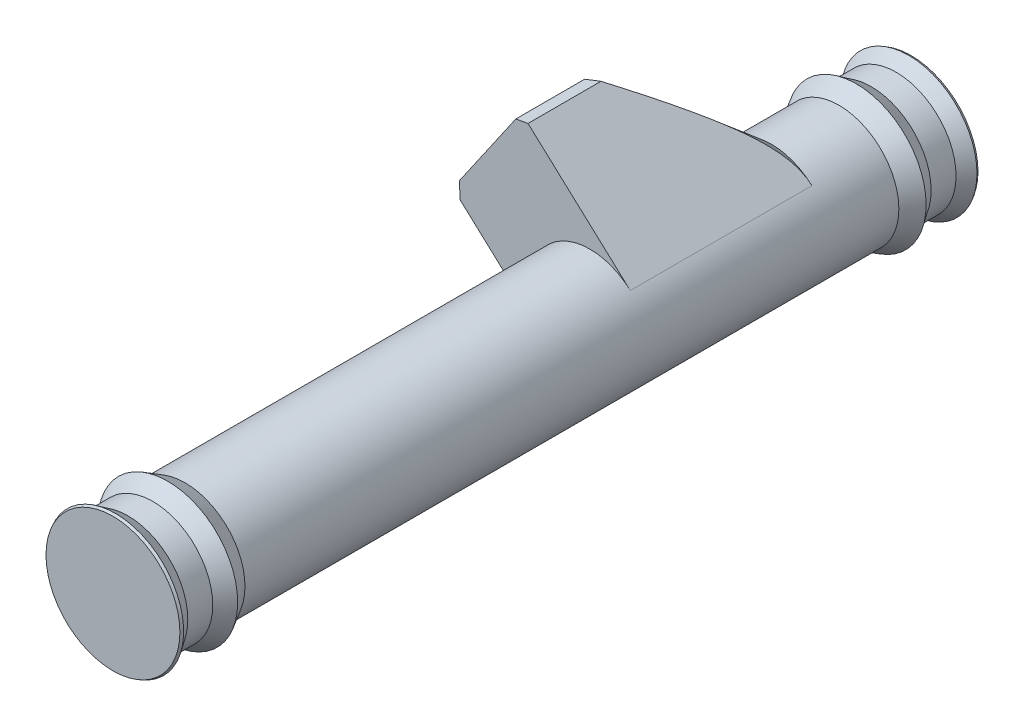
ISO-10303-21;
HEADER;
FILE_DESCRIPTION(('STEP AP214'),'2;1');
FILE_NAME('part.step','',(''),(''),'','','');
FILE_SCHEMA(('AUTOMOTIVE_DESIGN { 1 0 10303 214 1 1 1 1 }'));
ENDSEC;
DATA;
#1=APPLICATION_CONTEXT('core data for automotive mechanical design processes');
#2=APPLICATION_PROTOCOL_DEFINITION('international standard','automotive_design',2000,#1);
#3=PRODUCT_CONTEXT('',#1,'mechanical');
#4=PRODUCT('Part','Part','',(#3));
#5=PRODUCT_RELATED_PRODUCT_CATEGORY('part','',(#4));
#6=PRODUCT_DEFINITION_FORMATION('','',#4);
#7=PRODUCT_DEFINITION_CONTEXT('part definition',#1,'design');
#8=PRODUCT_DEFINITION('design','',#6,#7);
#9=PRODUCT_DEFINITION_SHAPE('','',#8);
#10=(LENGTH_UNIT() NAMED_UNIT(*) SI_UNIT(.MILLI.,.METRE.));
#11=(NAMED_UNIT(*) PLANE_ANGLE_UNIT() SI_UNIT($,.RADIAN.));
#12=(NAMED_UNIT(*) SI_UNIT($,.STERADIAN.) SOLID_ANGLE_UNIT());
#13=UNCERTAINTY_MEASURE_WITH_UNIT(LENGTH_MEASURE(1.E-05),#10,'distance_accuracy_value','');
#14=(GEOMETRIC_REPRESENTATION_CONTEXT(3) GLOBAL_UNCERTAINTY_ASSIGNED_CONTEXT((#13)) GLOBAL_UNIT_ASSIGNED_CONTEXT((#10,
#11,#12)) REPRESENTATION_CONTEXT('',''));
#15=CARTESIAN_POINT('',(0.,0.,0.));
#16=DIRECTION('',(0.,0.,1.));
#17=DIRECTION('',(1.,0.,0.));
#18=AXIS2_PLACEMENT_3D('',#15,#16,#17);
#19=CARTESIAN_POINT('',(58.1017180293076,-1.78433251703025,52.5));
#20=DIRECTION('',(0.,0.,-1.));
#21=DIRECTION('',(-1.,0.,0.));
#22=AXIS2_PLACEMENT_3D('',#19,#20,#21);
#23=CYLINDRICAL_SURFACE('',#22,5.99999999999999);
#24=CARTESIAN_POINT('',(58.1017180293076,-1.78433251703025,45.2679491924311));
#25=DIRECTION('',(0.,0.,-1.));
#26=DIRECTION('',(-1.,0.,0.));
#27=AXIS2_PLACEMENT_3D('',#24,#25,#26);
#28=CIRCLE('',#27,5.99999999999999);
#29=CARTESIAN_POINT('',(52.1017180293076,-1.78433251703025,45.2679491924311));
#30=VERTEX_POINT('',#29);
#31=EDGE_CURVE('E398',#30,#30,#28,.T.);
#32=ORIENTED_EDGE('',*,*,#31,.T.);
#33=EDGE_LOOP('',(#32));
#34=FACE_BOUND('',#33,.T.);
#35=CARTESIAN_POINT('',(58.1017180293076,-1.78433251703025,-20.2679491924311));
#36=DIRECTION('',(0.,0.,1.));
#37=DIRECTION('',(1.,0.,0.));
#38=AXIS2_PLACEMENT_3D('',#35,#36,#37);
#39=CIRCLE('',#38,5.99999999999999);
#40=CARTESIAN_POINT('',(64.1017180293076,-1.78433251703025,-20.2679491924311));
#41=VERTEX_POINT('',#40);
#42=EDGE_CURVE('E404',#41,#41,#39,.T.);
#43=ORIENTED_EDGE('',*,*,#42,.T.);
#44=EDGE_LOOP('',(#43));
#45=FACE_BOUND('',#44,.T.);
#46=DIRECTION('',(0.,0.,1.));
#47=VECTOR('',#46,1.);
#48=CARTESIAN_POINT('',(54.0520101920713,-6.21150615638832,-1.5));
#49=LINE('',#48,#47);
#50=CARTESIAN_POINT('',(54.0520101920713,-6.21150615638831,-13.5000000000001));
#51=VERTEX_POINT('',#50);
#52=CARTESIAN_POINT('',(54.0520101920713,-6.21150615638831,4.7));
#53=VERTEX_POINT('',#52);
#54=EDGE_CURVE('E177',#51,#53,#49,.T.);
#55=ORIENTED_EDGE('',*,*,#54,.F.);
#56=CARTESIAN_POINT('',(58.1017180293076,-1.78433251703025,-13.5000000000001));
#57=DIRECTION('',(0.,0.,1.));
#58=DIRECTION('',(1.,0.,0.));
#59=AXIS2_PLACEMENT_3D('',#56,#57,#58);
#60=CIRCLE('',#59,5.99999999999999);
#61=CARTESIAN_POINT('',(62.1514258665439,2.64284112232781,-13.5000000000001));
#62=VERTEX_POINT('',#61);
#63=EDGE_CURVE('E188',#51,#62,#60,.F.);
#64=ORIENTED_EDGE('',*,*,#63,.T.);
#65=DIRECTION('',(0.,0.,1.));
#66=VECTOR('',#65,1.);
#67=CARTESIAN_POINT('',(62.1514258665439,2.6428411223278,-1.5));
#68=LINE('',#67,#66);
#69=CARTESIAN_POINT('',(62.1514258665439,2.6428411223278,4.7));
#70=VERTEX_POINT('',#69);
#71=EDGE_CURVE('E176',#62,#70,#68,.T.);
#72=ORIENTED_EDGE('',*,*,#71,.T.);
#73=CARTESIAN_POINT('',(58.1017180293076,-1.78433251703025,4.7));
#74=DIRECTION('',(0.,0.,1.));
#75=DIRECTION('',(1.,0.,0.));
#76=AXIS2_PLACEMENT_3D('',#73,#74,#75);
#77=CIRCLE('',#76,5.99999999999999);
#78=EDGE_CURVE('E181',#70,#53,#77,.T.);
#79=ORIENTED_EDGE('',*,*,#78,.T.);
#80=EDGE_LOOP('',(#55,#64,#72,#79));
#81=FACE_BOUND('',#80,.T.);
#82=ADVANCED_FACE('F49',(#34,#45,#81),#23,.T.);
#83=CARTESIAN_POINT('',(58.1017180293076,-1.78433251703025,52.501));
#84=DIRECTION('',(0.,0.,-1.));
#85=DIRECTION('',(-1.,0.,0.));
#86=AXIS2_PLACEMENT_3D('',#83,#84,#85);
#87=CYLINDRICAL_SURFACE('',#86,1.4);
#88=CARTESIAN_POINT('',(58.1017180293076,-1.78433251703025,-4.9973174555522));
#89=DIRECTION('',(0.,0.,-1.));
#90=DIRECTION('',(-1.,0.,0.));
#91=AXIS2_PLACEMENT_3D('',#88,#89,#90);
#92=CIRCLE('',#91,1.4);
#93=CARTESIAN_POINT('',(56.7017180293076,-1.78433251703025,-4.9973174555522));
#94=VERTEX_POINT('',#93);
#95=EDGE_CURVE('E322',#94,#94,#92,.T.);
#96=ORIENTED_EDGE('',*,*,#95,.T.);
#97=EDGE_LOOP('',(#96));
#98=FACE_BOUND('',#97,.T.);
#99=CARTESIAN_POINT('',(58.1017180293076,-1.78433251703025,0.));
#100=DIRECTION('',(0.,0.,1.));
#101=DIRECTION('',(1.,0.,0.));
#102=AXIS2_PLACEMENT_3D('',#99,#100,#101);
#103=CIRCLE('',#102,1.4);
#104=CARTESIAN_POINT('',(59.5017180293076,-1.78433251703025,0.));
#105=VERTEX_POINT('',#104);
#106=EDGE_CURVE('E293',#105,#105,#103,.F.);
#107=ORIENTED_EDGE('',*,*,#106,.F.);
#108=EDGE_LOOP('',(#107));
#109=FACE_BOUND('',#108,.T.);
#110=ADVANCED_FACE('F233',(#98,#109),#87,.F.);
#111=CARTESIAN_POINT('',(58.1017180293076,-1.78433251703025,-23.5));
#112=DIRECTION('',(0.,0.,1.));
#113=DIRECTION('',(1.,0.,0.));
#114=AXIS2_PLACEMENT_3D('',#111,#112,#113);
#115=CIRCLE('',#114,6.);
#116=CARTESIAN_POINT('',(64.1017180293076,-1.78433251703025,-23.5));
#117=VERTEX_POINT('',#116);
#118=EDGE_CURVE('E270',#117,#117,#115,.T.);
#119=ORIENTED_EDGE('',*,*,#118,.F.);
#120=EDGE_LOOP('',(#119));
#121=FACE_BOUND('',#120,.T.);
#122=CARTESIAN_POINT('',(58.1017180293076,-1.78433251703025,-26.));
#123=DIRECTION('',(0.,0.,1.));
#124=DIRECTION('',(1.,0.,0.));
#125=AXIS2_PLACEMENT_3D('',#122,#123,#124);
#126=CIRCLE('',#125,5.99999999999999);
#127=CARTESIAN_POINT('',(64.1017180293076,-1.78433251703025,-26.));
#128=VERTEX_POINT('',#127);
#129=EDGE_CURVE('E285',#128,#128,#126,.T.);
#130=ORIENTED_EDGE('',*,*,#129,.T.);
#131=EDGE_LOOP('',(#130));
#132=FACE_BOUND('',#131,.T.);
#133=ADVANCED_FACE('F230',(#121,#132),#23,.T.);
#134=CARTESIAN_POINT('',(0.,0.,-27.5));
#135=DIRECTION('',(0.,0.,1.));
#136=DIRECTION('',(1.,0.,0.));
#137=AXIS2_PLACEMENT_3D('',#134,#135,#136);
#138=PLANE('',#137);
#139=CARTESIAN_POINT('',(58.1017180293076,-1.78433251703025,-27.5));
#140=DIRECTION('',(0.,0.,1.));
#141=DIRECTION('',(1.,0.,0.));
#142=AXIS2_PLACEMENT_3D('',#139,#140,#141);
#143=CIRCLE('',#142,6.7);
#144=CARTESIAN_POINT('',(64.8017180293076,-1.78433251703025,-27.5));
#145=VERTEX_POINT('',#144);
#146=EDGE_CURVE('E11',#145,#145,#143,.F.);
#147=ORIENTED_EDGE('',*,*,#146,.T.);
#148=EDGE_LOOP('',(#147));
#149=FACE_BOUND('',#148,.T.);
#150=CARTESIAN_POINT('',(58.1017180293076,-1.78433251703025,-27.5));
#151=DIRECTION('',(0.,0.,-1.));
#152=DIRECTION('',(-1.,0.,0.));
#153=AXIS2_PLACEMENT_3D('',#150,#151,#152);
#154=CIRCLE('',#153,3.5);
#155=CARTESIAN_POINT('',(54.6017180293076,-1.78433251703025,-27.5));
#156=VERTEX_POINT('',#155);
#157=EDGE_CURVE('E289',#156,#156,#154,.T.);
#158=ORIENTED_EDGE('',*,*,#157,.F.);
#159=EDGE_LOOP('',(#158));
#160=FACE_BOUND('',#159,.T.);
#161=ADVANCED_FACE('F227',(#149,#160),#138,.F.);
#162=CARTESIAN_POINT('',(58.1017180293076,-1.78433251703025,4.7));
#163=DIRECTION('',(0.,0.,1.));
#164=DIRECTION('',(1.,0.,0.));
#165=AXIS2_PLACEMENT_3D('',#162,#163,#164);
#166=PLANE('',#165);
#167=DIRECTION('',(-0.56841470062174,-0.822742200277279,0.));
#168=VECTOR('',#167,1.);
#169=CARTESIAN_POINT('',(51.2449403687312,12.6194274040442,4.7));
#170=LINE('',#169,#168);
#171=CARTESIAN_POINT('',(50.6765256681095,11.7966852037669,4.7));
#172=VERTEX_POINT('',#171);
#173=CARTESIAN_POINT('',(45.0250407455987,3.61653937908204,4.7));
#174=VERTEX_POINT('',#173);
#175=EDGE_CURVE('E165',#172,#174,#170,.T.);
#176=ORIENTED_EDGE('',*,*,#175,.T.);
#177=DIRECTION('',(-0.0444847713910527,0.999010062569084,0.));
#178=VECTOR('',#177,1.);
#179=CARTESIAN_POINT('',(45.290936828055,-2.35478189930472,4.7));
#180=LINE('',#179,#178);
#181=CARTESIAN_POINT('',(45.0979532479023,1.97911782535348,4.7));
#182=VERTEX_POINT('',#181);
#183=EDGE_CURVE('E340',#174,#182,#180,.F.);
#184=ORIENTED_EDGE('',*,*,#183,.T.);
#185=DIRECTION('',(0.737862273226343,-0.67495130620605,0.));
#186=VECTOR('',#185,1.);
#187=CARTESIAN_POINT('',(44.360090974676,2.65406913155952,4.7));
#188=LINE('',#187,#186);
#189=EDGE_CURVE('E173',#182,#53,#188,.T.);
#190=ORIENTED_EDGE('',*,*,#189,.T.);
#191=ORIENTED_EDGE('',*,*,#78,.F.);
#192=DIRECTION('',(-0.737862273226343,0.67495130620605,0.));
#193=VECTOR('',#192,1.);
#194=CARTESIAN_POINT('',(62.1514258665439,2.6428411223278,4.7));
#195=LINE('',#194,#193);
#196=CARTESIAN_POINT('',(51.8998737728878,12.0203343582911,4.7));
#197=VERTEX_POINT('',#196);
#198=EDGE_CURVE('E160',#70,#197,#195,.T.);
#199=ORIENTED_EDGE('',*,*,#198,.T.);
#200=DIRECTION('',(0.983696478320158,0.17983669964865,0.));
#201=VECTOR('',#200,1.);
#202=CARTESIAN_POINT('',(55.4590318644937,12.6710099059104,4.7));
#203=LINE('',#202,#201);
#204=EDGE_CURVE('E337',#197,#172,#203,.F.);
#205=ORIENTED_EDGE('',*,*,#204,.T.);
#206=EDGE_LOOP('',(#176,#184,#190,#191,#199,#205));
#207=FACE_BOUND('',#206,.T.);
#208=ADVANCED_FACE('F229',(#207),#166,.T.);
#209=CARTESIAN_POINT('',(44.360090974676,2.65406913155952,-1.5));
#210=DIRECTION('',(-0.67495130620605,-0.737862273226343,0.));
#211=DIRECTION('',(0.737862273226343,-0.67495130620605,0.));
#212=AXIS2_PLACEMENT_3D('',#209,#210,#211);
#213=PLANE('',#212);
#214=ORIENTED_EDGE('',*,*,#189,.F.);
#215=DIRECTION('',(0.,0.,-1.));
#216=VECTOR('',#215,1.);
#217=CARTESIAN_POINT('',(45.0979532479023,1.97911782535348,-1.5));
#218=LINE('',#217,#216);
#219=CARTESIAN_POINT('',(45.0979532479023,1.97911782535348,-4.51726510554778));
#220=VERTEX_POINT('',#219);
#221=EDGE_CURVE('E74',#182,#220,#218,.T.);
#222=ORIENTED_EDGE('',*,*,#221,.T.);
#223=CARTESIAN_POINT('',(44.360090974676,2.65406913155953,-3.44085182386826));
#224=CARTESIAN_POINT('',(44.5076075814179,2.51912995656661,-3.65756668432391));
#225=CARTESIAN_POINT('',(44.6554339646457,2.38390741697927,-3.87389476790729));
#226=CARTESIAN_POINT('',(44.9518014455375,2.11280856072496,-4.30565386154003));
#227=CARTESIAN_POINT('',(45.100342550647,1.97693223724713,-4.52108486220014));
#228=CARTESIAN_POINT('',(45.5475036104462,1.56789663216567,-5.16631280755206));
#229=CARTESIAN_POINT('',(45.8473373149526,1.29362708641928,-5.59456755551725));
#230=CARTESIAN_POINT('',(46.4737134565255,0.720656478934077,-6.47721823539895));
#231=CARTESIAN_POINT('',(46.8005836154402,0.421655637280222,-6.93118911417232));
#232=CARTESIAN_POINT('',(47.2958517994258,-0.031385424490966,-7.60502703641495));
#233=CARTESIAN_POINT('',(47.4616892595877,-0.183083396342444,-7.82835000611448));
#234=CARTESIAN_POINT('',(47.7954115703181,-0.488352167644003,-8.27216520507182));
#235=CARTESIAN_POINT('',(47.9632963830606,-0.641922932493208,-8.4926574864741));
#236=CARTESIAN_POINT('',(48.3013916350225,-0.951191803140214,-8.92995929704021));
#237=CARTESIAN_POINT('',(48.4715999917321,-1.1068880039854,-9.14677177749727));
#238=CARTESIAN_POINT('',(48.8150287126275,-1.42103560600804,-9.57600514347519));
#239=CARTESIAN_POINT('',(48.9882492193579,-1.57948713757656,-9.78842582011486));
#240=CARTESIAN_POINT('',(49.3389645374913,-1.90030007336408,-10.2083018464419));
#241=CARTESIAN_POINT('',(49.5164715242134,-2.06267261482077,-10.4157385856724));
#242=CARTESIAN_POINT('',(49.8760996807287,-2.39163847036878,-10.8231125173614));
#243=CARTESIAN_POINT('',(50.0582202770672,-2.55823125989871,-11.0230506342826));
#244=CARTESIAN_POINT('',(50.4204258169322,-2.88955474819413,-11.4045865410479));
#245=CARTESIAN_POINT('',(50.6002693729677,-3.05406464043754,-11.5866025498817));
#246=CARTESIAN_POINT('',(50.9667153369867,-3.38926700955586,-11.9381496900407));
#247=CARTESIAN_POINT('',(51.1533216749161,-3.55996308130527,-12.1076733825643));
#248=CARTESIAN_POINT('',(51.533617394444,-3.90783436020609,-12.4281910744551));
#249=CARTESIAN_POINT('',(51.7272600737009,-4.08496684691016,-12.5792856644354));
#250=CARTESIAN_POINT('',(52.1238982592589,-4.44778721481295,-12.856614373759));
#251=CARTESIAN_POINT('',(52.3268776087767,-4.63346031677385,-12.9828895826408));
#252=CARTESIAN_POINT('',(52.6541928012547,-4.93286824792901,-13.1542656191524));
#253=CARTESIAN_POINT('',(52.7752024108975,-5.04356044219822,-13.2110329174368));
#254=CARTESIAN_POINT('',(53.020288691991,-5.2677503914064,-13.3108918023889));
#255=CARTESIAN_POINT('',(53.1443644441949,-5.38124730547451,-13.3539874355454));
#256=CARTESIAN_POINT('',(53.3338342675173,-5.55456271863275,-13.4072485176762));
#257=CARTESIAN_POINT('',(53.3983577668649,-5.61358487187988,-13.4232268683428));
#258=CARTESIAN_POINT('',(53.5279144376004,-5.73209539520326,-13.4508164613948));
#259=CARTESIAN_POINT('',(53.5929475852654,-5.79158374357929,-13.4624279058308));
#260=CARTESIAN_POINT('',(53.7235514461668,-5.91105217245763,-13.4811183254554));
#261=CARTESIAN_POINT('',(53.7891231517026,-5.97103316065484,-13.4881845983686));
#262=CARTESIAN_POINT('',(53.9204653169488,-6.09117694521941,-13.49763288203));
#263=CARTESIAN_POINT('',(53.9862358207456,-6.15133978191439,-13.5000137635954));
#264=CARTESIAN_POINT('',(54.0520101920713,-6.21150615638832,-13.5000000000001));
#265=B_SPLINE_CURVE_WITH_KNOTS('',3,(#223,#224,#225,#226,#227,#228,#229,#230,#231,#232,#233,
#234,#235,#236,#237,#238,#239,#240,#241,#242,#243,#244,#245,#246,#247,#248,#249,#250,#251,#252,
#253,#254,#255,#256,#257,#258,#259,#260,#261,#262,#263,#264),.UNSPECIFIED.,.F.,.F.,(4,2,2,2,2,2,
2,2,2,2,2,2,2,2,2,2,2,2,2,2,4),(0.,0.884542349569408,1.76909393397646,3.54014232744325,
5.44292905625557,6.39342954527996,7.34391249981308,8.29359321372861,9.24331899254403,
10.1961656773657,11.1488945023746,12.0612070217322,12.9740584781614,13.881680317947,
14.7877866550766,15.3079639026119,15.8279870460596,16.0945781271836,16.3611568720006,
16.6284774174318,16.8958623794314),.UNSPECIFIED.);
#266=EDGE_CURVE('E444',#220,#51,#265,.T.);
#267=ORIENTED_EDGE('',*,*,#266,.T.);
#268=ORIENTED_EDGE('',*,*,#54,.T.);
#269=EDGE_LOOP('',(#214,#222,#267,#268));
#270=FACE_BOUND('',#269,.T.);
#271=ADVANCED_FACE('F440',(#270),#213,.T.);
#272=CARTESIAN_POINT('',(51.2449403687312,12.6194274040442,-1.5));
#273=DIRECTION('',(-0.822742200277279,0.56841470062174,0.));
#274=DIRECTION('',(-0.56841470062174,-0.822742200277279,0.));
#275=AXIS2_PLACEMENT_3D('',#272,#273,#274);
#276=PLANE('',#275);
#277=DIRECTION('',(0.56841470062174,0.822742200277279,0.));
#278=VECTOR('',#277,1.);
#279=CARTESIAN_POINT('',(51.2449403687312,12.6194274040442,3.4));
#280=LINE('',#279,#278);
#281=CARTESIAN_POINT('',(45.9120312601348,4.90039872817399,3.4));
#282=VERTEX_POINT('',#281);
#283=CARTESIAN_POINT('',(49.3940768334445,9.94042642857823,3.4));
#284=VERTEX_POINT('',#283);
#285=EDGE_CURVE('E137',#282,#284,#280,.T.);
#286=ORIENTED_EDGE('',*,*,#285,.F.);
#287=DIRECTION('',(0.,0.,-1.));
#288=VECTOR('',#287,1.);
#289=CARTESIAN_POINT('',(45.9120312601348,4.90039872817399,3.4));
#290=LINE('',#289,#288);
#291=CARTESIAN_POINT('',(45.9120312601348,4.90039872817399,0.));
#292=VERTEX_POINT('',#291);
#293=EDGE_CURVE('E312',#282,#292,#290,.T.);
#294=ORIENTED_EDGE('',*,*,#293,.T.);
#295=DIRECTION('',(0.56841470062174,0.822742200277279,0.));
#296=VECTOR('',#295,1.);
#297=CARTESIAN_POINT('',(51.2449403687312,12.6194274040442,0.));
#298=LINE('',#297,#296);
#299=CARTESIAN_POINT('',(49.3940768334445,9.94042642857823,0.));
#300=VERTEX_POINT('',#299);
#301=EDGE_CURVE('E308',#292,#300,#298,.T.);
#302=ORIENTED_EDGE('',*,*,#301,.T.);
#303=DIRECTION('',(0.,0.,-1.));
#304=VECTOR('',#303,1.);
#305=CARTESIAN_POINT('',(49.3940768334445,9.94042642857823,3.4));
#306=LINE('',#305,#304);
#307=EDGE_CURVE('E315',#300,#284,#306,.F.);
#308=ORIENTED_EDGE('',*,*,#307,.T.);
#309=EDGE_LOOP('',(#286,#294,#302,#308));
#310=FACE_BOUND('',#309,.T.);
#311=CARTESIAN_POINT('',(51.2449403687312,12.6194274040442,-1.63901845043032));
#312=CARTESIAN_POINT('',(51.1116007821199,12.4264272850243,-1.77836945086787));
#313=CARTESIAN_POINT('',(50.9771008478272,12.2317476404688,-1.91434684846819));
#314=CARTESIAN_POINT('',(50.7055704129569,11.8387255261866,-2.1785044533064));
#315=CARTESIAN_POINT('',(50.5685387481725,11.6403813713485,-2.30668095082134));
#316=CARTESIAN_POINT('',(50.2909946624983,11.2386549003903,-2.55482732274821));
#317=CARTESIAN_POINT('',(50.1504658234923,11.0352488201469,-2.67474080896881));
#318=CARTESIAN_POINT('',(49.8667180233654,10.6245428881136,-2.90410133677005));
#319=CARTESIAN_POINT('',(49.7234994086049,10.4172435376573,-3.01354971502838));
#320=CARTESIAN_POINT('',(49.2892415851629,9.78868442974629,-3.32431613086902));
#321=CARTESIAN_POINT('',(48.9938790864923,9.36116699965556,-3.50780014888565));
#322=CARTESIAN_POINT('',(48.5437635308462,8.70965488671012,-3.73715665479324));
#323=CARTESIAN_POINT('',(48.3927109932005,8.49101645768262,-3.80591499917921));
#324=CARTESIAN_POINT('',(48.0884734331758,8.05065297083406,-3.92673234821214));
#325=CARTESIAN_POINT('',(47.9352888633847,7.82892856810376,-3.97879484229954));
#326=CARTESIAN_POINT('',(47.5834435962663,7.31965611454214,-4.07709387258229));
#327=CARTESIAN_POINT('',(47.38423961109,7.031321690945,-4.11746248277067));
#328=CARTESIAN_POINT('',(46.9845112158815,6.45274161722875,-4.16643453159277));
#329=CARTESIAN_POINT('',(46.7839864777804,6.16249549225179,-4.17502975491627));
#330=CARTESIAN_POINT('',(46.3842817819443,5.5839497217895,-4.1600419013605));
#331=CARTESIAN_POINT('',(46.1850999388555,5.29564734738063,-4.13661019953881));
#332=CARTESIAN_POINT('',(45.788740989392,4.72194432065651,-4.05899279035012));
#333=CARTESIAN_POINT('',(45.5915633336092,4.43654287310982,-4.00481575604688));
#334=CARTESIAN_POINT('',(45.3082557988506,4.02647419570312,-3.90585881050578));
#335=CARTESIAN_POINT('',(45.220800466043,3.89988846021571,-3.87234859384606));
#336=CARTESIAN_POINT('',(45.046637105285,3.64779866295852,-3.79992301426823));
#337=CARTESIAN_POINT('',(44.959928899098,3.52229434320324,-3.76100898067333));
#338=CARTESIAN_POINT('',(44.7007909536516,3.14720952717255,-3.63650193378605));
#339=CARTESIAN_POINT('',(44.5295397569924,2.89933489235862,-3.54321216482118));
#340=CARTESIAN_POINT('',(44.360090974676,2.65406913155953,-3.44085182386826));
#341=B_SPLINE_CURVE_WITH_KNOTS('',3,(#311,#312,#313,#314,#315,#316,#317,#318,#319,#320,#321,
#322,#323,#324,#325,#326,#327,#328,#329,#330,#331,#332,#333,#334,#335,#336,#337,#338,#339,#340),
.UNSPECIFIED.,.F.,.F.,(4,2,2,2,2,2,2,2,2,2,2,2,2,2,4),(0.,0.818566388463539,1.63751905304038,
2.46159767695585,3.28557090271482,4.93517052798182,5.75821915970532,6.58109566160606,
7.63799903314234,8.69517565795293,9.74737278518674,10.7992732417072,11.2715910251105,
11.7437928248663,12.6892273393257),.UNSPECIFIED.);
#342=CARTESIAN_POINT('',(50.6765256681095,11.7966852037669,-2.20421143054369));
#343=VERTEX_POINT('',#342);
#344=CARTESIAN_POINT('',(45.0250407455987,3.61653937908204,-3.78946529075706));
#345=VERTEX_POINT('',#344);
#346=EDGE_CURVE('E201',#343,#345,#341,.T.);
#347=ORIENTED_EDGE('',*,*,#346,.T.);
#348=DIRECTION('',(0.,0.,1.));
#349=VECTOR('',#348,1.);
#350=CARTESIAN_POINT('',(45.0250407455987,3.61653937908204,-1.5));
#351=LINE('',#350,#349);
#352=EDGE_CURVE('E333',#345,#174,#351,.T.);
#353=ORIENTED_EDGE('',*,*,#352,.T.);
#354=ORIENTED_EDGE('',*,*,#175,.F.);
#355=DIRECTION('',(0.,0.,-1.));
#356=VECTOR('',#355,1.);
#357=CARTESIAN_POINT('',(50.6765256681095,11.7966852037669,-1.5));
#358=LINE('',#357,#356);
#359=EDGE_CURVE('E330',#172,#343,#358,.T.);
#360=ORIENTED_EDGE('',*,*,#359,.T.);
#361=EDGE_LOOP('',(#347,#353,#354,#360));
#362=FACE_BOUND('',#361,.T.);
#363=ADVANCED_FACE('F217',(#310,#362),#276,.T.);
#364=CARTESIAN_POINT('',(62.1514258665439,2.6428411223278,-1.5));
#365=DIRECTION('',(0.67495130620605,0.737862273226343,0.));
#366=DIRECTION('',(-0.737862273226343,0.67495130620605,0.));
#367=AXIS2_PLACEMENT_3D('',#364,#365,#366);
#368=PLANE('',#367);
#369=CARTESIAN_POINT('',(62.1514258665439,2.64284112232781,-13.5000000000001));
#370=CARTESIAN_POINT('',(62.0935479295807,2.69578432131121,-13.5000055890045));
#371=CARTESIAN_POINT('',(62.0356787375847,2.74871952093324,-13.4981659723714));
#372=CARTESIAN_POINT('',(61.9200740409951,2.85446763111315,-13.4908499277985));
#373=CARTESIAN_POINT('',(61.8623385177414,2.9072805587401,-13.4853740425773));
#374=CARTESIAN_POINT('',(61.6897306519976,3.06517168378141,-13.4636030424027));
#375=CARTESIAN_POINT('',(61.5752051163911,3.16993264345691,-13.4419641111264));
#376=CARTESIAN_POINT('',(61.3499351562044,3.37599583355902,-13.385953907957));
#377=CARTESIAN_POINT('',(61.2391595716712,3.47732656720594,-13.351807502315));
#378=CARTESIAN_POINT('',(61.0198244382582,3.67796094053773,-13.2721323639921));
#379=CARTESIAN_POINT('',(60.911266094853,3.77726347752823,-13.2265976089565));
#380=CARTESIAN_POINT('',(60.6291889914455,4.03529036994981,-13.0939444457482));
#381=CARTESIAN_POINT('',(60.457754149428,4.19210848458649,-12.9986839960233));
#382=CARTESIAN_POINT('',(60.1216762762128,4.499531980467,-12.7882896636506));
#383=CARTESIAN_POINT('',(59.9570386012254,4.6501324621769,-12.673140465408));
#384=CARTESIAN_POINT('',(59.632342069164,4.94714500284678,-12.4267737240459));
#385=CARTESIAN_POINT('',(59.4723456380485,5.09349995835566,-12.2954067082921));
#386=CARTESIAN_POINT('',(59.1578350937685,5.3811949800149,-12.02136857634));
#387=CARTESIAN_POINT('',(59.0033194948781,5.52253640521645,-11.8787005580128));
#388=CARTESIAN_POINT('',(58.6380480426849,5.85666440270783,-11.5261119282531));
#389=CARTESIAN_POINT('',(58.4294636199072,6.04746468308056,-11.312078938916));
#390=CARTESIAN_POINT('',(58.0191457309127,6.4227984075243,-10.8722808872872));
#391=CARTESIAN_POINT('',(57.8174138746704,6.60733037888902,-10.6465130990614));
#392=CARTESIAN_POINT('',(57.4201756096454,6.97069966280878,-10.1875018048737));
#393=CARTESIAN_POINT('',(57.2246459153916,7.14955827548939,-9.95429513694359));
#394=CARTESIAN_POINT('',(56.8377966393525,7.50342434730497,-9.48164846584043));
#395=CARTESIAN_POINT('',(56.6464765269768,7.67843229179143,-9.24220925664009));
#396=CARTESIAN_POINT('',(56.2283285937181,8.06092846212179,-8.70902049419137));
#397=CARTESIAN_POINT('',(56.0022526934628,8.26772887693608,-8.41419032931622));
#398=CARTESIAN_POINT('',(55.5538342149166,8.67791469182841,-7.81935033071742));
#399=CARTESIAN_POINT('',(55.3314918177894,8.88129992618904,-7.51934024706903));
#400=CARTESIAN_POINT('',(54.8896952675452,9.28542840583165,-6.91526736830381));
#401=CARTESIAN_POINT('',(54.6702420041802,9.48617083722301,-6.6112033801869));
#402=CARTESIAN_POINT('',(54.2337029704759,9.88549006209722,-5.99996848813291));
#403=CARTESIAN_POINT('',(54.0166172256211,10.0840668322684,-5.69279755082033));
#404=CARTESIAN_POINT('',(53.5843996997884,10.4794330058909,-5.07601633368203));
#405=CARTESIAN_POINT('',(53.36926767962,10.6762226281392,-4.76640636137134));
#406=CARTESIAN_POINT('',(52.9405893759398,11.0683513376692,-4.14517317361384));
#407=CARTESIAN_POINT('',(52.727043106526,11.2636904120551,-3.83354994031436));
#408=CARTESIAN_POINT('',(52.3014332968589,11.6530122508216,-3.20889024091771));
#409=CARTESIAN_POINT('',(52.0893687511415,11.8469959349393,-2.89585503202438));
#410=CARTESIAN_POINT('',(51.6663631820087,12.2339355736475,-2.26840639735352));
#411=CARTESIAN_POINT('',(51.455422132505,12.4268915521019,-1.95399300388999));
#412=CARTESIAN_POINT('',(51.2449403687312,12.6194274040442,-1.63901845043032));
#413=B_SPLINE_CURVE_WITH_KNOTS('',3,(#369,#370,#371,#372,#373,#374,#375,#376,#377,#378,#379,
#380,#381,#382,#383,#384,#385,#386,#387,#388,#389,#390,#391,#392,#393,#394,#395,#396,#397,#398,
#399,#400,#401,#402,#403,#404,#405,#406,#407,#408,#409,#410,#411,#412),.UNSPECIFIED.,.F.,.F.,(4,
2,2,2,2,2,2,2,2,2,2,2,2,2,2,2,2,2,2,2,2,4),(0.,0.235275748577876,0.470516389773018,
0.939977484061543,1.40138236936633,1.86303177132508,2.61501924057157,3.36758839076695,
4.1276998613496,4.88760368378632,5.95084792701143,7.01434027000664,8.07320117554515,
9.13192784508023,10.4074657324962,11.6830653359927,12.9590489987917,14.2350463830675,
15.5108853846449,16.7867357153419,18.0616142682078,19.3364630874765),.UNSPECIFIED.);
#414=CARTESIAN_POINT('',(51.8998737728878,12.0203343582911,-2.6147690178633));
#415=VERTEX_POINT('',#414);
#416=EDGE_CURVE('E192',#62,#415,#413,.T.);
#417=ORIENTED_EDGE('',*,*,#416,.T.);
#418=DIRECTION('',(0.,0.,1.));
#419=VECTOR('',#418,1.);
#420=CARTESIAN_POINT('',(51.8998737728878,12.0203343582911,-1.5));
#421=LINE('',#420,#419);
#422=EDGE_CURVE('E465',#415,#197,#421,.T.);
#423=ORIENTED_EDGE('',*,*,#422,.T.);
#424=ORIENTED_EDGE('',*,*,#198,.F.);
#425=ORIENTED_EDGE('',*,*,#71,.F.);
#426=EDGE_LOOP('',(#417,#423,#424,#425));
#427=FACE_BOUND('',#426,.T.);
#428=ADVANCED_FACE('F213',(#427),#368,.T.);
#429=CARTESIAN_POINT('',(58.1017180293076,-1.78433251703025,-1.5));
#430=DIRECTION('',(0.,0.,1.));
#431=DIRECTION('',(1.,0.,0.));
#432=AXIS2_PLACEMENT_3D('',#429,#430,#431);
#433=CONICAL_SURFACE('',#432,16.0691955741275,0.698131700797737);
#434=ORIENTED_EDGE('',*,*,#266,.F.);
#435=CARTESIAN_POINT('',(45.0979532479023,1.97911782535348,-4.51726510554778));
#436=CARTESIAN_POINT('',(45.0917376263116,2.11870421233592,-4.46390197070944));
#437=CARTESIAN_POINT('',(45.0855565905923,2.25751389231431,-4.40852450203525));
#438=CARTESIAN_POINT('',(45.0732674592507,2.53349521101244,-4.29406090083733));
#439=CARTESIAN_POINT('',(45.0671593192039,2.67066784738824,-4.23497718050686));
#440=CARTESIAN_POINT('',(45.0550120433064,2.94346346878768,-4.11335463444369));
#441=CARTESIAN_POINT('',(45.0489729040203,3.07908653096071,-4.05081598163598));
#442=CARTESIAN_POINT('',(45.0369583116769,3.34890243139825,-3.92249857954683));
#443=CARTESIAN_POINT('',(45.0309829021808,3.48309429139677,-3.85671776770226));
#444=CARTESIAN_POINT('',(45.0250407455987,3.61653937908204,-3.78946529075706));
#445=B_SPLINE_CURVE_WITH_KNOTS('',3,(#435,#436,#437,#438,#439,#440,#441,#442,#443,#444),
.UNSPECIFIED.,.F.,.F.,(4,2,2,2,4),(0.,0.448677775543881,0.897066502099932,1.34543280636922,
1.79408812504961),.UNSPECIFIED.);
#446=EDGE_CURVE('E352',#220,#345,#445,.T.);
#447=ORIENTED_EDGE('',*,*,#446,.T.);
#448=ORIENTED_EDGE('',*,*,#346,.F.);
#449=CARTESIAN_POINT('',(50.6765256681095,11.7966852037669,-2.20421143054369));
#450=CARTESIAN_POINT('',(50.7771153799981,11.8150747397704,-2.24248960877065));
#451=CARTESIAN_POINT('',(50.8780582010181,11.8335288302196,-2.2798134862844));
#452=CARTESIAN_POINT('',(51.0805962226469,11.8705562773701,-2.35244718284364));
#453=CARTESIAN_POINT('',(51.1821911416164,11.8891295825828,-2.38775781380733));
#454=CARTESIAN_POINT('',(51.3860629525224,11.9264008694409,-2.45629137311776));
#455=CARTESIAN_POINT('',(51.4883398557753,11.945098853155,-2.48951426672603));
#456=CARTESIAN_POINT('',(51.6935955011837,11.9826231288519,-2.55379374786918));
#457=CARTESIAN_POINT('',(51.7965745116424,12.001449469885,-2.58484944964358));
#458=CARTESIAN_POINT('',(51.8998737728878,12.0203343582911,-2.61476901786331));
#459=B_SPLINE_CURVE_WITH_KNOTS('',3,(#449,#450,#451,#452,#453,#454,#455,#456,#457,#458),
.UNSPECIFIED.,.F.,.F.,(4,2,2,2,4),(0.,0.327556984650749,0.654980921264555,0.982410304540318,
1.30997273818338),.UNSPECIFIED.);
#460=EDGE_CURVE('E66',#343,#415,#459,.T.);
#461=ORIENTED_EDGE('',*,*,#460,.T.);
#462=ORIENTED_EDGE('',*,*,#416,.F.);
#463=ORIENTED_EDGE('',*,*,#63,.F.);
#464=EDGE_LOOP('',(#434,#447,#448,#461,#462,#463));
#465=FACE_BOUND('',#464,.T.);
#466=ADVANCED_FACE('F209',(#465),#433,.T.);
#467=CARTESIAN_POINT('',(58.1017180293076,-1.78433251703025,3.4));
#468=DIRECTION('',(0.,0.,-1.));
#469=DIRECTION('',(-1.,0.,0.));
#470=AXIS2_PLACEMENT_3D('',#467,#468,#469);
#471=CYLINDRICAL_SURFACE('',#470,2.80000000000003);
#472=CARTESIAN_POINT('',(58.1017180293076,-1.78433251703025,0.));
#473=DIRECTION('',(0.,0.,1.));
#474=DIRECTION('',(1.,0.,0.));
#475=AXIS2_PLACEMENT_3D('',#472,#473,#474);
#476=CIRCLE('',#475,2.80000000000003);
#477=CARTESIAN_POINT('',(55.8279229826533,-3.41830194324682,0.));
#478=VERTEX_POINT('',#477);
#479=CARTESIAN_POINT('',(60.3789355225516,-0.155136246330005,0.));
#480=VERTEX_POINT('',#479);
#481=EDGE_CURVE('E296',#478,#480,#476,.T.);
#482=ORIENTED_EDGE('',*,*,#481,.F.);
#483=DIRECTION('',(0.,0.,-1.));
#484=VECTOR('',#483,1.);
#485=CARTESIAN_POINT('',(55.8279229826533,-3.41830194324682,3.4));
#486=LINE('',#485,#484);
#487=CARTESIAN_POINT('',(55.8279229826533,-3.41830194324682,3.4));
#488=VERTEX_POINT('',#487);
#489=EDGE_CURVE('E153',#488,#478,#486,.T.);
#490=ORIENTED_EDGE('',*,*,#489,.F.);
#491=CARTESIAN_POINT('',(58.1017180293076,-1.78433251703025,3.4));
#492=DIRECTION('',(0.,0.,1.));
#493=DIRECTION('',(1.,0.,0.));
#494=AXIS2_PLACEMENT_3D('',#491,#492,#493);
#495=CIRCLE('',#494,2.80000000000003);
#496=CARTESIAN_POINT('',(60.3789355225516,-0.155136246330005,3.4));
#497=VERTEX_POINT('',#496);
#498=EDGE_CURVE('E135',#488,#497,#495,.T.);
#499=ORIENTED_EDGE('',*,*,#498,.T.);
#500=DIRECTION('',(0.,0.,-1.));
#501=VECTOR('',#500,1.);
#502=CARTESIAN_POINT('',(60.3789355225516,-0.155136246330005,3.4));
#503=LINE('',#502,#501);
#504=EDGE_CURVE('E150',#497,#480,#503,.T.);
#505=ORIENTED_EDGE('',*,*,#504,.T.);
#506=EDGE_LOOP('',(#482,#490,#499,#505));
#507=FACE_BOUND('',#506,.T.);
#508=ADVANCED_FACE('F149',(#507),#471,.F.);
#509=CARTESIAN_POINT('',(18.7159800538136,-34.4640634925739,3.4));
#510=DIRECTION('',(0.,0.,-1.));
#511=DIRECTION('',(-1.,0.,0.));
#512=AXIS2_PLACEMENT_3D('',#509,#510,#511);
#513=CYLINDRICAL_SURFACE('',#512,53.9713289365576);
#514=CARTESIAN_POINT('',(18.7159800538136,-34.4640634925739,0.));
#515=DIRECTION('',(0.,0.,1.));
#516=DIRECTION('',(1.,0.,0.));
#517=AXIS2_PLACEMENT_3D('',#514,#515,#516);
#518=CIRCLE('',#517,53.9713289365576);
#519=EDGE_CURVE('E158',#480,#300,#518,.T.);
#520=ORIENTED_EDGE('',*,*,#519,.F.);
#521=ORIENTED_EDGE('',*,*,#504,.F.);
#522=CARTESIAN_POINT('',(18.7159800538136,-34.4640634925739,3.4));
#523=DIRECTION('',(0.,0.,1.));
#524=DIRECTION('',(1.,0.,0.));
#525=AXIS2_PLACEMENT_3D('',#522,#523,#524);
#526=CIRCLE('',#525,53.9713289365576);
#527=EDGE_CURVE('E131',#497,#284,#526,.T.);
#528=ORIENTED_EDGE('',*,*,#527,.T.);
#529=ORIENTED_EDGE('',*,*,#307,.F.);
#530=EDGE_LOOP('',(#520,#521,#528,#529));
#531=FACE_BOUND('',#530,.T.);
#532=ADVANCED_FACE('F157',(#531),#513,.F.);
#533=CARTESIAN_POINT('',(22.5024786467876,-33.0730115699634,3.4));
#534=DIRECTION('',(0.,0.,-1.));
#535=DIRECTION('',(-1.,0.,0.));
#536=AXIS2_PLACEMENT_3D('',#533,#534,#535);
#537=CYLINDRICAL_SURFACE('',#536,44.6092708215205);
#538=CARTESIAN_POINT('',(22.5024786467876,-33.0730115699634,3.4));
#539=DIRECTION('',(0.,0.,-1.));
#540=DIRECTION('',(1.,0.,0.));
#541=AXIS2_PLACEMENT_3D('',#538,#539,#540);
#542=CIRCLE('',#541,44.6092708215205);
#543=EDGE_CURVE('E143',#282,#488,#542,.T.);
#544=ORIENTED_EDGE('',*,*,#543,.T.);
#545=ORIENTED_EDGE('',*,*,#489,.T.);
#546=CARTESIAN_POINT('',(22.5024786467876,-33.0730115699634,0.));
#547=DIRECTION('',(0.,0.,-1.));
#548=DIRECTION('',(1.,0.,0.));
#549=AXIS2_PLACEMENT_3D('',#546,#547,#548);
#550=CIRCLE('',#549,44.6092708215205);
#551=EDGE_CURVE('E155',#292,#478,#550,.T.);
#552=ORIENTED_EDGE('',*,*,#551,.F.);
#553=ORIENTED_EDGE('',*,*,#293,.F.);
#554=EDGE_LOOP('',(#544,#545,#552,#553));
#555=FACE_BOUND('',#554,.T.);
#556=ADVANCED_FACE('F311',(#555),#537,.T.);
#557=CARTESIAN_POINT('',(58.1017180293076,-1.78433251703025,3.4));
#558=DIRECTION('',(0.,0.,1.));
#559=DIRECTION('',(1.,0.,0.));
#560=AXIS2_PLACEMENT_3D('',#557,#558,#559);
#561=PLANE('',#560);
#562=ORIENTED_EDGE('',*,*,#285,.T.);
#563=ORIENTED_EDGE('',*,*,#527,.F.);
#564=ORIENTED_EDGE('',*,*,#498,.F.);
#565=ORIENTED_EDGE('',*,*,#543,.F.);
#566=EDGE_LOOP('',(#562,#563,#564,#565));
#567=FACE_BOUND('',#566,.T.);
#568=ADVANCED_FACE('F133',(#567),#561,.F.);
#569=CARTESIAN_POINT('',(58.1017180293076,-1.78433251703025,0.));
#570=DIRECTION('',(0.,0.,1.));
#571=DIRECTION('',(1.,0.,0.));
#572=AXIS2_PLACEMENT_3D('',#569,#570,#571);
#573=PLANE('',#572);
#574=ORIENTED_EDGE('',*,*,#106,.T.);
#575=EDGE_LOOP('',(#574));
#576=FACE_BOUND('',#575,.T.);
#577=ORIENTED_EDGE('',*,*,#551,.T.);
#578=ORIENTED_EDGE('',*,*,#481,.T.);
#579=ORIENTED_EDGE('',*,*,#519,.T.);
#580=ORIENTED_EDGE('',*,*,#301,.F.);
#581=EDGE_LOOP('',(#577,#578,#579,#580));
#582=FACE_BOUND('',#581,.T.);
#583=ADVANCED_FACE('F306',(#576,#582),#573,.T.);
#584=CARTESIAN_POINT('',(58.1017180293076,-1.78433251703025,-4.5));
#585=DIRECTION('',(0.,0.,-1.));
#586=DIRECTION('',(-1.,0.,0.));
#587=AXIS2_PLACEMENT_3D('',#584,#585,#586);
#588=CYLINDRICAL_SURFACE('',#587,3.5);
#589=CARTESIAN_POINT('',(58.1017180293076,-1.78433251703025,-7.50000000000002));
#590=DIRECTION('',(0.,0.,-1.));
#591=DIRECTION('',(-1.,0.,0.));
#592=AXIS2_PLACEMENT_3D('',#589,#590,#591);
#593=CIRCLE('',#592,3.5);
#594=CARTESIAN_POINT('',(54.6017180293076,-1.78433251703025,-7.50000000000002));
#595=VERTEX_POINT('',#594);
#596=EDGE_CURVE('E317',#595,#595,#593,.F.);
#597=ORIENTED_EDGE('',*,*,#596,.T.);
#598=EDGE_LOOP('',(#597));
#599=FACE_BOUND('',#598,.T.);
#600=ORIENTED_EDGE('',*,*,#157,.T.);
#601=EDGE_LOOP('',(#600));
#602=FACE_BOUND('',#601,.T.);
#603=ADVANCED_FACE('F423',(#599,#602),#588,.F.);
#604=CARTESIAN_POINT('',(58.1017180293076,-1.78433251703025,-4.5));
#605=DIRECTION('',(0.,0.,-1.));
#606=DIRECTION('',(-1.,0.,0.));
#607=AXIS2_PLACEMENT_3D('',#604,#605,#606);
#608=CONICAL_SURFACE('',#607,0.982701106468115,0.698131700797738);
#609=ORIENTED_EDGE('',*,*,#596,.F.);
#610=EDGE_LOOP('',(#609));
#611=FACE_BOUND('',#610,.T.);
#612=ORIENTED_EDGE('',*,*,#95,.F.);
#613=EDGE_LOOP('',(#612));
#614=FACE_BOUND('',#613,.T.);
#615=ADVANCED_FACE('F416',(#611,#614),#608,.F.);
#616=CARTESIAN_POINT('',(58.1017180293076,-1.78433251703025,-26.));
#617=DIRECTION('',(0.,0.,-1.));
#618=DIRECTION('',(-1.,0.,0.));
#619=AXIS2_PLACEMENT_3D('',#616,#617,#618);
#620=CONICAL_SURFACE('',#619,5.99999999999999,0.588002603547567);
#621=CARTESIAN_POINT('',(58.1017180293076,-1.78433251703025,-27.258845726812));
#622=DIRECTION('',(0.,0.,-1.));
#623=DIRECTION('',(-1.,0.,0.));
#624=AXIS2_PLACEMENT_3D('',#621,#622,#623);
#625=CIRCLE('',#624,6.83923048454133);
#626=CARTESIAN_POINT('',(51.2624875447662,-1.78433251703025,-27.258845726812));
#627=VERTEX_POINT('',#626);
#628=EDGE_CURVE('E59',#627,#627,#625,.F.);
#629=ORIENTED_EDGE('',*,*,#628,.T.);
#630=EDGE_LOOP('',(#629));
#631=FACE_BOUND('',#630,.T.);
#632=ORIENTED_EDGE('',*,*,#129,.F.);
#633=EDGE_LOOP('',(#632));
#634=FACE_BOUND('',#633,.T.);
#635=ADVANCED_FACE('F411',(#631,#634),#620,.T.);
#636=CARTESIAN_POINT('',(58.1017180293076,-1.78433251703025,-22.));
#637=DIRECTION('',(0.,0.,1.));
#638=DIRECTION('',(1.,0.,0.));
#639=AXIS2_PLACEMENT_3D('',#636,#637,#638);
#640=CONICAL_SURFACE('',#639,6.99999999999999,0.588002603547567);
#641=ORIENTED_EDGE('',*,*,#118,.T.);
#642=EDGE_LOOP('',(#641));
#643=FACE_BOUND('',#642,.T.);
#644=CARTESIAN_POINT('',(58.1017180293076,-1.78433251703025,-22.));
#645=DIRECTION('',(0.,0.,1.));
#646=DIRECTION('',(1.,0.,0.));
#647=AXIS2_PLACEMENT_3D('',#644,#645,#646);
#648=CIRCLE('',#647,6.99999999999999);
#649=CARTESIAN_POINT('',(65.1017180293076,-1.78433251703025,-22.));
#650=VERTEX_POINT('',#649);
#651=EDGE_CURVE('E276',#650,#650,#648,.T.);
#652=ORIENTED_EDGE('',*,*,#651,.F.);
#653=EDGE_LOOP('',(#652));
#654=FACE_BOUND('',#653,.T.);
#655=ADVANCED_FACE('F415',(#643,#654),#640,.T.);
#656=CARTESIAN_POINT('',(58.1017180293076,-1.78433251703025,47.));
#657=DIRECTION('',(0.,0.,-1.));
#658=DIRECTION('',(1.,0.,0.));
#659=AXIS2_PLACEMENT_3D('',#656,#657,#658);
#660=CONICAL_SURFACE('',#659,6.99999999999999,0.588002603547567);
#661=CARTESIAN_POINT('',(58.1017180293076,-1.78433251703025,48.5));
#662=DIRECTION('',(0.,0.,1.));
#663=DIRECTION('',(1.,0.,0.));
#664=AXIS2_PLACEMENT_3D('',#661,#662,#663);
#665=CIRCLE('',#664,6.);
#666=CARTESIAN_POINT('',(64.1017180293076,-1.78433251703025,48.5));
#667=VERTEX_POINT('',#666);
#668=EDGE_CURVE('E264',#667,#667,#665,.T.);
#669=ORIENTED_EDGE('',*,*,#668,.F.);
#670=EDGE_LOOP('',(#669));
#671=FACE_BOUND('',#670,.T.);
#672=CARTESIAN_POINT('',(58.1017180293076,-1.78433251703025,47.));
#673=DIRECTION('',(0.,0.,1.));
#674=DIRECTION('',(1.,0.,0.));
#675=AXIS2_PLACEMENT_3D('',#672,#673,#674);
#676=CIRCLE('',#675,6.99999999999999);
#677=CARTESIAN_POINT('',(65.1017180293076,-1.78433251703025,47.));
#678=VERTEX_POINT('',#677);
#679=EDGE_CURVE('E271',#678,#678,#676,.T.);
#680=ORIENTED_EDGE('',*,*,#679,.T.);
#681=EDGE_LOOP('',(#680));
#682=FACE_BOUND('',#681,.T.);
#683=ADVANCED_FACE('F225',(#671,#682),#660,.T.);
#684=CARTESIAN_POINT('',(0.,0.,52.5));
#685=DIRECTION('',(0.,0.,1.));
#686=DIRECTION('',(1.,0.,0.));
#687=AXIS2_PLACEMENT_3D('',#684,#685,#686);
#688=PLANE('',#687);
#689=CARTESIAN_POINT('',(58.1017180293076,-1.78433251703025,52.5));
#690=DIRECTION('',(0.,0.,1.));
#691=DIRECTION('',(1.,0.,0.));
#692=AXIS2_PLACEMENT_3D('',#689,#690,#691);
#693=CIRCLE('',#692,6.71016863424111);
#694=CARTESIAN_POINT('',(64.8118866635487,-1.78433251703025,52.5));
#695=VERTEX_POINT('',#694);
#696=EDGE_CURVE('E396',#695,#695,#693,.T.);
#697=ORIENTED_EDGE('',*,*,#696,.T.);
#698=EDGE_LOOP('',(#697));
#699=FACE_BOUND('',#698,.T.);
#700=ADVANCED_FACE('F221',(#699),#688,.T.);
#701=CARTESIAN_POINT('',(58.1017180293076,-1.78433251703025,51.));
#702=DIRECTION('',(0.,0.,1.));
#703=DIRECTION('',(-1.,0.,0.));
#704=AXIS2_PLACEMENT_3D('',#701,#702,#703);
#705=CONICAL_SURFACE('',#704,5.99999999999999,0.588002603547567);
#706=CARTESIAN_POINT('',(58.1017180293076,-1.78433251703025,52.2503849116986));
#707=DIRECTION('',(0.,0.,-1.));
#708=DIRECTION('',(-1.,0.,0.));
#709=AXIS2_PLACEMENT_3D('',#706,#707,#708);
#710=CIRCLE('',#709,6.83358994113242);
#711=CARTESIAN_POINT('',(51.2681280881752,-1.78433251703025,52.2503849116986));
#712=VERTEX_POINT('',#711);
#713=EDGE_CURVE('E393',#712,#712,#710,.T.);
#714=ORIENTED_EDGE('',*,*,#713,.T.);
#715=EDGE_LOOP('',(#714));
#716=FACE_BOUND('',#715,.T.);
#717=CARTESIAN_POINT('',(58.1017180293076,-1.78433251703025,51.));
#718=DIRECTION('',(0.,0.,1.));
#719=DIRECTION('',(1.,0.,0.));
#720=AXIS2_PLACEMENT_3D('',#717,#718,#719);
#721=CIRCLE('',#720,5.99999999999999);
#722=CARTESIAN_POINT('',(64.1017180293076,-1.78433251703025,51.));
#723=VERTEX_POINT('',#722);
#724=EDGE_CURVE('E267',#723,#723,#721,.T.);
#725=ORIENTED_EDGE('',*,*,#724,.T.);
#726=EDGE_LOOP('',(#725));
#727=FACE_BOUND('',#726,.T.);
#728=ADVANCED_FACE('F224',(#716,#727),#705,.T.);
#729=ORIENTED_EDGE('',*,*,#668,.T.);
#730=EDGE_LOOP('',(#729));
#731=FACE_BOUND('',#730,.T.);
#732=ORIENTED_EDGE('',*,*,#724,.F.);
#733=EDGE_LOOP('',(#732));
#734=FACE_BOUND('',#733,.T.);
#735=ADVANCED_FACE('F235',(#731,#734),#23,.T.);
#736=CARTESIAN_POINT('',(45.0250407455987,3.61653937908204,-1.5));
#737=DIRECTION('',(0.999010062569084,0.0444847713910527,0.));
#738=DIRECTION('',(0.,0.,1.));
#739=AXIS2_PLACEMENT_3D('',#736,#737,#738);
#740=PLANE('',#739);
#741=ORIENTED_EDGE('',*,*,#446,.F.);
#742=ORIENTED_EDGE('',*,*,#221,.F.);
#743=ORIENTED_EDGE('',*,*,#183,.F.);
#744=ORIENTED_EDGE('',*,*,#352,.F.);
#745=EDGE_LOOP('',(#741,#742,#743,#744));
#746=FACE_BOUND('',#745,.T.);
#747=ADVANCED_FACE('F248',(#746),#740,.F.);
#748=CARTESIAN_POINT('',(51.8998737728878,12.0203343582911,-1.5));
#749=DIRECTION('',(0.17983669964865,-0.983696478320158,0.));
#750=DIRECTION('',(0.,0.,1.));
#751=AXIS2_PLACEMENT_3D('',#748,#749,#750);
#752=PLANE('',#751);
#753=ORIENTED_EDGE('',*,*,#460,.F.);
#754=ORIENTED_EDGE('',*,*,#359,.F.);
#755=ORIENTED_EDGE('',*,*,#204,.F.);
#756=ORIENTED_EDGE('',*,*,#422,.F.);
#757=EDGE_LOOP('',(#753,#754,#755,#756));
#758=FACE_BOUND('',#757,.T.);
#759=ADVANCED_FACE('F255',(#758),#752,.F.);
#760=CARTESIAN_POINT('',(58.1017180293076,-1.78433251703025,47.));
#761=DIRECTION('',(0.,0.,1.));
#762=DIRECTION('',(1.,0.,0.));
#763=AXIS2_PLACEMENT_3D('',#760,#761,#762);
#764=CONICAL_SURFACE('',#763,6.99999999999999,0.523598775598289);
#765=ORIENTED_EDGE('',*,*,#31,.F.);
#766=EDGE_LOOP('',(#765));
#767=FACE_BOUND('',#766,.T.);
#768=ORIENTED_EDGE('',*,*,#679,.F.);
#769=EDGE_LOOP('',(#768));
#770=FACE_BOUND('',#769,.T.);
#771=ADVANCED_FACE('F366',(#767,#770),#764,.T.);
#772=CARTESIAN_POINT('',(58.1017180293076,-1.78433251703025,-20.2679491924311));
#773=DIRECTION('',(0.,0.,-1.));
#774=DIRECTION('',(-1.,0.,0.));
#775=AXIS2_PLACEMENT_3D('',#772,#773,#774);
#776=CONICAL_SURFACE('',#775,5.99999999999999,0.523598775598288);
#777=ORIENTED_EDGE('',*,*,#651,.T.);
#778=EDGE_LOOP('',(#777));
#779=FACE_BOUND('',#778,.T.);
#780=ORIENTED_EDGE('',*,*,#42,.F.);
#781=EDGE_LOOP('',(#780));
#782=FACE_BOUND('',#781,.T.);
#783=ADVANCED_FACE('F374',(#779,#782),#776,.T.);
#784=CARTESIAN_POINT('',(58.1017180293076,-1.78433251703025,52.5));
#785=DIRECTION('',(0.,0.,-1.));
#786=DIRECTION('',(-1.,0.,0.));
#787=AXIS2_PLACEMENT_3D('',#784,#785,#786);
#788=CONICAL_SURFACE('',#787,6.71016863424111,0.459194947649015);
#789=ORIENTED_EDGE('',*,*,#713,.F.);
#790=EDGE_LOOP('',(#789));
#791=FACE_BOUND('',#790,.T.);
#792=ORIENTED_EDGE('',*,*,#696,.F.);
#793=EDGE_LOOP('',(#792));
#794=FACE_BOUND('',#793,.T.);
#795=ADVANCED_FACE('F380',(#791,#794),#788,.T.);
#796=CARTESIAN_POINT('',(58.1017180293076,-1.78433251703025,-27.258845726812));
#797=DIRECTION('',(0.,0.,1.));
#798=DIRECTION('',(1.,0.,0.));
#799=AXIS2_PLACEMENT_3D('',#796,#797,#798);
#800=CONICAL_SURFACE('',#799,6.83923048454133,0.52359877559829);
#801=ORIENTED_EDGE('',*,*,#146,.F.);
#802=EDGE_LOOP('',(#801));
#803=FACE_BOUND('',#802,.T.);
#804=ORIENTED_EDGE('',*,*,#628,.F.);
#805=EDGE_LOOP('',(#804));
#806=FACE_BOUND('',#805,.T.);
#807=ADVANCED_FACE('F52',(#803,#806),#800,.T.);
#808=CLOSED_SHELL('',(#82,#110,#133,#161,#208,#271,#363,#428,#466,#508,#532,#556,#568,#583,#603,
#615,#635,#655,#683,#700,#728,#735,#747,#759,#771,#783,#795,#807));
#809=MANIFOLD_SOLID_BREP('B2',#808);
#810=ADVANCED_BREP_SHAPE_REPRESENTATION('',(#18,#809),#14);
#811=SHAPE_DEFINITION_REPRESENTATION(#9,#810);
ENDSEC;
END-ISO-10303-21;
